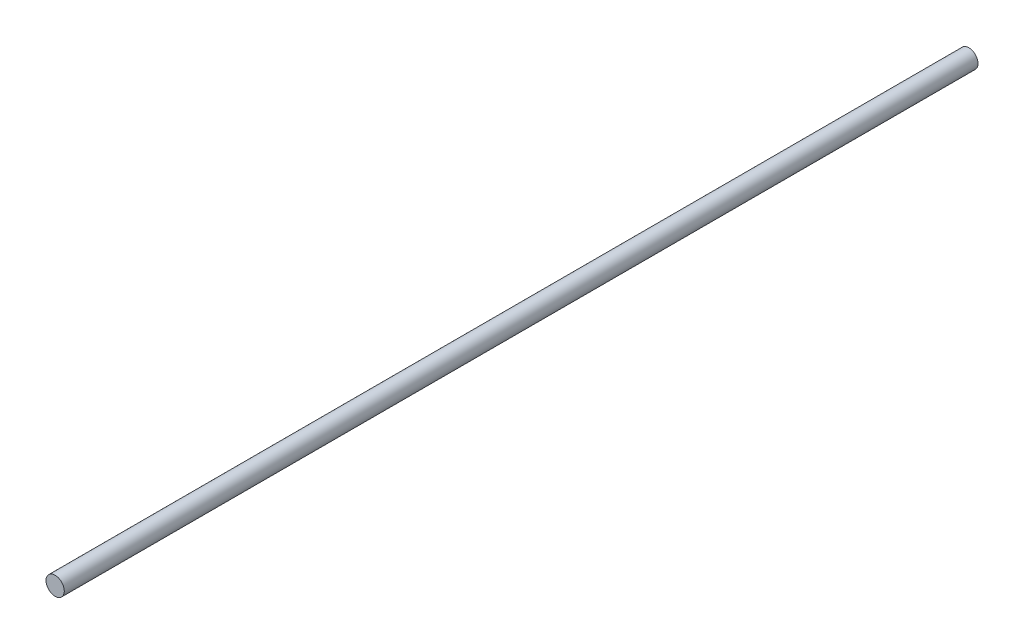
ISO-10303-21;
HEADER;
FILE_DESCRIPTION(('STEP AP214'),'2;1');
FILE_NAME('part.step','',(''),(''),'','','');
FILE_SCHEMA(('AUTOMOTIVE_DESIGN { 1 0 10303 214 1 1 1 1 }'));
ENDSEC;
DATA;
#1=APPLICATION_CONTEXT('core data for automotive mechanical design processes');
#2=APPLICATION_PROTOCOL_DEFINITION('international standard','automotive_design',2000,#1);
#3=PRODUCT_CONTEXT('',#1,'mechanical');
#4=PRODUCT('Part','Part','',(#3));
#5=PRODUCT_RELATED_PRODUCT_CATEGORY('part','',(#4));
#6=PRODUCT_DEFINITION_FORMATION('','',#4);
#7=PRODUCT_DEFINITION_CONTEXT('part definition',#1,'design');
#8=PRODUCT_DEFINITION('design','',#6,#7);
#9=PRODUCT_DEFINITION_SHAPE('','',#8);
#10=(LENGTH_UNIT() NAMED_UNIT(*) SI_UNIT(.MILLI.,.METRE.));
#11=(NAMED_UNIT(*) PLANE_ANGLE_UNIT() SI_UNIT($,.RADIAN.));
#12=(NAMED_UNIT(*) SI_UNIT($,.STERADIAN.) SOLID_ANGLE_UNIT());
#13=UNCERTAINTY_MEASURE_WITH_UNIT(LENGTH_MEASURE(1.E-05),#10,'distance_accuracy_value','');
#14=(GEOMETRIC_REPRESENTATION_CONTEXT(3) GLOBAL_UNCERTAINTY_ASSIGNED_CONTEXT((#13)) GLOBAL_UNIT_ASSIGNED_CONTEXT((#10,
#11,#12)) REPRESENTATION_CONTEXT('',''));
#15=CARTESIAN_POINT('',(0.,0.,0.));
#16=DIRECTION('',(0.,0.,1.));
#17=DIRECTION('',(1.,0.,0.));
#18=AXIS2_PLACEMENT_3D('',#15,#16,#17);
#19=CARTESIAN_POINT('',(0.,0.,100.));
#20=DIRECTION('',(0.,0.,-1.));
#21=DIRECTION('',(-1.,0.,0.));
#22=AXIS2_PLACEMENT_3D('',#19,#20,#21);
#23=CYLINDRICAL_SURFACE('',#22,1.);
#24=CARTESIAN_POINT('',(0.,0.,100.));
#25=DIRECTION('',(0.,0.,1.));
#26=DIRECTION('',(1.,0.,0.));
#27=AXIS2_PLACEMENT_3D('',#24,#25,#26);
#28=CIRCLE('',#27,1.);
#29=CARTESIAN_POINT('',(-1.,0.,100.));
#30=VERTEX_POINT('',#29);
#31=EDGE_CURVE('E10',#30,#30,#28,.T.);
#32=CARTESIAN_POINT('',(0.,0.,0.));
#33=DIRECTION('',(0.,0.,1.));
#34=DIRECTION('',(1.,0.,0.));
#35=AXIS2_PLACEMENT_3D('',#32,#33,#34);
#36=CIRCLE('',#35,1.);
#37=CARTESIAN_POINT('',(-1.,0.,0.));
#38=VERTEX_POINT('',#37);
#39=EDGE_CURVE('E40',#38,#38,#36,.T.);
#40=CARTESIAN_POINT('',(-1.,0.,100.));
#41=CARTESIAN_POINT('',(-1.,0.,98.9583333333333));
#42=CARTESIAN_POINT('',(-1.,0.,97.9166666666667));
#43=CARTESIAN_POINT('',(-1.,0.,95.8333333333333));
#44=CARTESIAN_POINT('',(-1.,0.,94.7916666666666));
#45=CARTESIAN_POINT('',(-1.,0.,92.7083333333333));
#46=CARTESIAN_POINT('',(-1.,0.,91.6666666666666));
#47=CARTESIAN_POINT('',(-1.,0.,89.5833333333333));
#48=CARTESIAN_POINT('',(-1.,0.,88.5416666666667));
#49=CARTESIAN_POINT('',(-1.,0.,86.4583333333333));
#50=CARTESIAN_POINT('',(-1.,0.,85.4166666666667));
#51=CARTESIAN_POINT('',(-1.,0.,83.3333333333333));
#52=CARTESIAN_POINT('',(-1.,0.,82.2916666666667));
#53=CARTESIAN_POINT('',(-1.,0.,80.2083333333333));
#54=CARTESIAN_POINT('',(-1.,0.,79.1666666666666));
#55=CARTESIAN_POINT('',(-1.,0.,77.0833333333333));
#56=CARTESIAN_POINT('',(-1.,0.,76.0416666666666));
#57=CARTESIAN_POINT('',(-1.,0.,73.9583333333333));
#58=CARTESIAN_POINT('',(-1.,0.,72.9166666666667));
#59=CARTESIAN_POINT('',(-1.,0.,70.8333333333333));
#60=CARTESIAN_POINT('',(-1.,0.,69.7916666666667));
#61=CARTESIAN_POINT('',(-1.,0.,67.7083333333333));
#62=CARTESIAN_POINT('',(-1.,0.,66.6666666666667));
#63=CARTESIAN_POINT('',(-1.,0.,64.5833333333333));
#64=CARTESIAN_POINT('',(-1.,0.,63.5416666666667));
#65=CARTESIAN_POINT('',(-1.,0.,61.4583333333333));
#66=CARTESIAN_POINT('',(-1.,0.,60.4166666666667));
#67=CARTESIAN_POINT('',(-1.,0.,58.3333333333333));
#68=CARTESIAN_POINT('',(-1.,0.,57.2916666666667));
#69=CARTESIAN_POINT('',(-1.,0.,55.2083333333333));
#70=CARTESIAN_POINT('',(-1.,0.,54.1666666666667));
#71=CARTESIAN_POINT('',(-1.,0.,52.0833333333333));
#72=CARTESIAN_POINT('',(-1.,0.,51.0416666666667));
#73=CARTESIAN_POINT('',(-1.,0.,48.9583333333333));
#74=CARTESIAN_POINT('',(-1.,0.,47.9166666666667));
#75=CARTESIAN_POINT('',(-1.,0.,45.8333333333333));
#76=CARTESIAN_POINT('',(-1.,0.,44.7916666666667));
#77=CARTESIAN_POINT('',(-1.,0.,42.7083333333333));
#78=CARTESIAN_POINT('',(-1.,0.,41.6666666666667));
#79=CARTESIAN_POINT('',(-1.,0.,39.5833333333333));
#80=CARTESIAN_POINT('',(-1.,0.,38.5416666666667));
#81=CARTESIAN_POINT('',(-1.,0.,36.4583333333333));
#82=CARTESIAN_POINT('',(-1.,0.,35.4166666666667));
#83=CARTESIAN_POINT('',(-1.,0.,33.3333333333333));
#84=CARTESIAN_POINT('',(-1.,0.,32.2916666666667));
#85=CARTESIAN_POINT('',(-1.,0.,30.2083333333333));
#86=CARTESIAN_POINT('',(-1.,0.,29.1666666666667));
#87=CARTESIAN_POINT('',(-1.,0.,27.0833333333333));
#88=CARTESIAN_POINT('',(-1.,0.,26.0416666666667));
#89=CARTESIAN_POINT('',(-1.,0.,23.9583333333333));
#90=CARTESIAN_POINT('',(-1.,0.,22.9166666666667));
#91=CARTESIAN_POINT('',(-1.,0.,20.8333333333333));
#92=CARTESIAN_POINT('',(-1.,0.,19.7916666666667));
#93=CARTESIAN_POINT('',(-1.,0.,17.7083333333333));
#94=CARTESIAN_POINT('',(-1.,0.,16.6666666666667));
#95=CARTESIAN_POINT('',(-1.,0.,14.5833333333333));
#96=CARTESIAN_POINT('',(-1.,0.,13.5416666666667));
#97=CARTESIAN_POINT('',(-1.,0.,11.4583333333333));
#98=CARTESIAN_POINT('',(-1.,0.,10.4166666666667));
#99=CARTESIAN_POINT('',(-1.,0.,8.33333333333333));
#100=CARTESIAN_POINT('',(-1.,0.,7.29166666666667));
#101=CARTESIAN_POINT('',(-1.,0.,5.20833333333334));
#102=CARTESIAN_POINT('',(-1.,0.,4.16666666666667));
#103=CARTESIAN_POINT('',(-1.,0.,2.08333333333334));
#104=CARTESIAN_POINT('',(-1.,0.,1.04166666666667));
#105=CARTESIAN_POINT('',(-1.,0.,0.));
#106=B_SPLINE_CURVE_WITH_KNOTS('',3,(#40,#41,#42,#43,#44,#45,#46,#47,#48,#49,#50,#51,#52,#53,
#54,#55,#56,#57,#58,#59,#60,#61,#62,#63,#64,#65,#66,#67,#68,#69,#70,#71,#72,#73,#74,#75,#76,#77,
#78,#79,#80,#81,#82,#83,#84,#85,#86,#87,#88,#89,#90,#91,#92,#93,#94,#95,#96,#97,#98,#99,#100,
#101,#102,#103,#104,#105),.UNSPECIFIED.,.F.,.F.,(4,2,2,2,2,2,2,2,2,2,2,2,2,2,2,2,2,2,2,2,2,2,2,
2,2,2,2,2,2,2,2,2,4),(0.,3.12499999999999,6.24999999999999,9.37499999999999,12.5,15.625,18.75,
21.875,25.,28.125,31.25,34.375,37.5,40.625,43.75,46.875,50.,53.125,56.25,59.375,62.5,65.625,
68.75,71.875,75.,78.125,81.25,84.375,87.5,90.625,93.75,96.875,100.),.UNSPECIFIED.);
#107=EDGE_CURVE('BSEAM37',#30,#38,#106,.T.);
#108=ORIENTED_EDGE('',*,*,#31,.F.);
#109=ORIENTED_EDGE('',*,*,#39,.T.);
#110=ORIENTED_EDGE('',*,*,#107,.T.);
#111=ORIENTED_EDGE('',*,*,#107,.F.);
#112=EDGE_LOOP('',(#108,#110,#109,#111));
#113=FACE_BOUND('',#112,.T.);
#114=ADVANCED_FACE('F37',(#113),#23,.T.);
#115=CARTESIAN_POINT('',(0.,0.,100.));
#116=DIRECTION('',(0.,0.,1.));
#117=DIRECTION('',(1.,0.,0.));
#118=AXIS2_PLACEMENT_3D('',#115,#116,#117);
#119=PLANE('',#118);
#120=ORIENTED_EDGE('',*,*,#31,.T.);
#121=EDGE_LOOP('',(#120));
#122=FACE_BOUND('',#121,.T.);
#123=ADVANCED_FACE('F54',(#122),#119,.T.);
#124=CARTESIAN_POINT('',(0.,0.,0.));
#125=DIRECTION('',(0.,0.,1.));
#126=DIRECTION('',(1.,0.,0.));
#127=AXIS2_PLACEMENT_3D('',#124,#125,#126);
#128=PLANE('',#127);
#129=ORIENTED_EDGE('',*,*,#39,.F.);
#130=EDGE_LOOP('',(#129));
#131=FACE_BOUND('',#130,.T.);
#132=ADVANCED_FACE('F52',(#131),#128,.F.);
#133=CLOSED_SHELL('',(#114,#123,#132));
#134=MANIFOLD_SOLID_BREP('B2',#133);
#135=ADVANCED_BREP_SHAPE_REPRESENTATION('',(#18,#134),#14);
#136=SHAPE_DEFINITION_REPRESENTATION(#9,#135);
ENDSEC;
END-ISO-10303-21;
